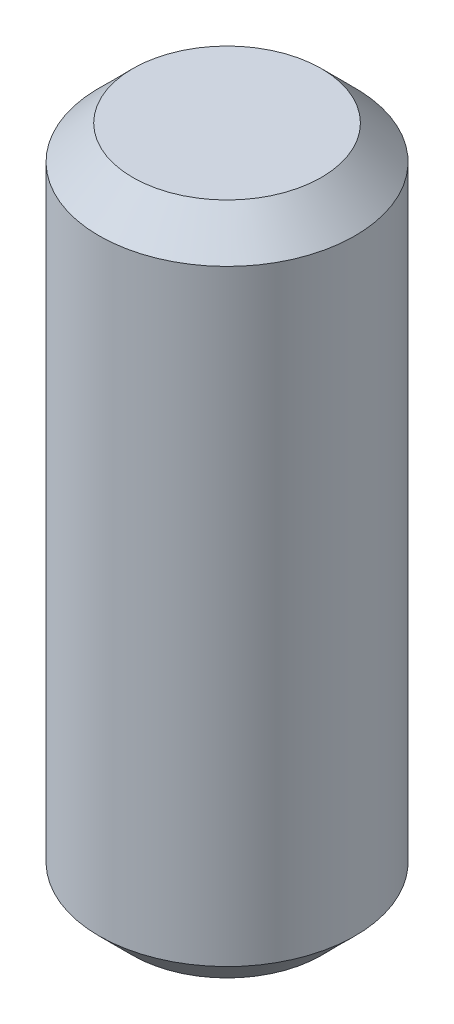
ISO-10303-21;
HEADER;
FILE_DESCRIPTION(('STEP AP214'),'2;1');
FILE_NAME('part.step','',(''),(''),'','','');
FILE_SCHEMA(('AUTOMOTIVE_DESIGN { 1 0 10303 214 1 1 1 1 }'));
ENDSEC;
DATA;
#1=APPLICATION_CONTEXT('core data for automotive mechanical design processes');
#2=APPLICATION_PROTOCOL_DEFINITION('international standard','automotive_design',2000,#1);
#3=PRODUCT_CONTEXT('',#1,'mechanical');
#4=PRODUCT('Part','Part','',(#3));
#5=PRODUCT_RELATED_PRODUCT_CATEGORY('part','',(#4));
#6=PRODUCT_DEFINITION_FORMATION('','',#4);
#7=PRODUCT_DEFINITION_CONTEXT('part definition',#1,'design');
#8=PRODUCT_DEFINITION('design','',#6,#7);
#9=PRODUCT_DEFINITION_SHAPE('','',#8);
#10=(LENGTH_UNIT() NAMED_UNIT(*) SI_UNIT(.MILLI.,.METRE.));
#11=(NAMED_UNIT(*) PLANE_ANGLE_UNIT() SI_UNIT($,.RADIAN.));
#12=(NAMED_UNIT(*) SI_UNIT($,.STERADIAN.) SOLID_ANGLE_UNIT());
#13=UNCERTAINTY_MEASURE_WITH_UNIT(LENGTH_MEASURE(1.E-05),#10,'distance_accuracy_value','');
#14=(GEOMETRIC_REPRESENTATION_CONTEXT(3) GLOBAL_UNCERTAINTY_ASSIGNED_CONTEXT((#13)) GLOBAL_UNIT_ASSIGNED_CONTEXT((#10,
#11,#12)) REPRESENTATION_CONTEXT('',''));
#15=CARTESIAN_POINT('',(0.,0.,0.));
#16=DIRECTION('',(0.,0.,1.));
#17=DIRECTION('',(1.,0.,0.));
#18=AXIS2_PLACEMENT_3D('',#15,#16,#17);
#19=CARTESIAN_POINT('',(0.,10.,0.));
#20=DIRECTION('',(0.,-1.,0.));
#21=DIRECTION('',(0.,0.,-1.));
#22=AXIS2_PLACEMENT_3D('',#19,#20,#21);
#23=CYLINDRICAL_SURFACE('',#22,1.9);
#24=CARTESIAN_POINT('',(0.,9.5,0.));
#25=DIRECTION('',(0.,1.,0.));
#26=DIRECTION('',(0.,0.,1.));
#27=AXIS2_PLACEMENT_3D('',#24,#25,#26);
#28=CIRCLE('',#27,1.9);
#29=CARTESIAN_POINT('',(0.,9.5,1.9));
#30=VERTEX_POINT('',#29);
#31=EDGE_CURVE('E10',#30,#30,#28,.F.);
#32=ORIENTED_EDGE('',*,*,#31,.T.);
#33=EDGE_LOOP('',(#32));
#34=FACE_BOUND('',#33,.T.);
#35=CARTESIAN_POINT('',(0.,0.499999999999997,0.));
#36=DIRECTION('',(0.,1.,0.));
#37=DIRECTION('',(0.,0.,1.));
#38=AXIS2_PLACEMENT_3D('',#35,#36,#37);
#39=CIRCLE('',#38,1.9);
#40=CARTESIAN_POINT('',(0.,0.499999999999997,1.9));
#41=VERTEX_POINT('',#40);
#42=EDGE_CURVE('E55',#41,#41,#39,.T.);
#43=ORIENTED_EDGE('',*,*,#42,.T.);
#44=EDGE_LOOP('',(#43));
#45=FACE_BOUND('',#44,.T.);
#46=ADVANCED_FACE('F39',(#34,#45),#23,.T.);
#47=CARTESIAN_POINT('',(0.,10.,0.));
#48=DIRECTION('',(0.,1.,0.));
#49=DIRECTION('',(0.,0.,1.));
#50=AXIS2_PLACEMENT_3D('',#47,#48,#49);
#51=PLANE('',#50);
#52=CARTESIAN_POINT('',(0.,10.,0.));
#53=DIRECTION('',(0.,1.,0.));
#54=DIRECTION('',(0.,0.,1.));
#55=AXIS2_PLACEMENT_3D('',#52,#53,#54);
#56=CIRCLE('',#55,1.4);
#57=CARTESIAN_POINT('',(0.,10.,1.4));
#58=VERTEX_POINT('',#57);
#59=EDGE_CURVE('E47',#58,#58,#56,.T.);
#60=ORIENTED_EDGE('',*,*,#59,.T.);
#61=EDGE_LOOP('',(#60));
#62=FACE_BOUND('',#61,.T.);
#63=ADVANCED_FACE('F72',(#62),#51,.T.);
#64=CARTESIAN_POINT('',(0.,0.,0.));
#65=DIRECTION('',(0.,1.,0.));
#66=DIRECTION('',(0.,0.,1.));
#67=AXIS2_PLACEMENT_3D('',#64,#65,#66);
#68=PLANE('',#67);
#69=CARTESIAN_POINT('',(0.,0.,0.));
#70=DIRECTION('',(0.,1.,0.));
#71=DIRECTION('',(0.,0.,1.));
#72=AXIS2_PLACEMENT_3D('',#69,#70,#71);
#73=CIRCLE('',#72,1.4);
#74=CARTESIAN_POINT('',(0.,0.,1.4));
#75=VERTEX_POINT('',#74);
#76=EDGE_CURVE('E51',#75,#75,#73,.F.);
#77=ORIENTED_EDGE('',*,*,#76,.T.);
#78=EDGE_LOOP('',(#77));
#79=FACE_BOUND('',#78,.T.);
#80=ADVANCED_FACE('F64',(#79),#68,.F.);
#81=CARTESIAN_POINT('',(0.,0.499999999999997,0.));
#82=DIRECTION('',(0.,1.,0.));
#83=DIRECTION('',(0.,0.,1.));
#84=AXIS2_PLACEMENT_3D('',#81,#82,#83);
#85=CONICAL_SURFACE('',#84,1.9,0.78539816339745);
#86=ORIENTED_EDGE('',*,*,#76,.F.);
#87=EDGE_LOOP('',(#86));
#88=FACE_BOUND('',#87,.T.);
#89=ORIENTED_EDGE('',*,*,#42,.F.);
#90=EDGE_LOOP('',(#89));
#91=FACE_BOUND('',#90,.T.);
#92=ADVANCED_FACE('F62',(#88,#91),#85,.T.);
#93=CARTESIAN_POINT('',(0.,10.,0.));
#94=DIRECTION('',(0.,-1.,0.));
#95=DIRECTION('',(0.,0.,-1.));
#96=AXIS2_PLACEMENT_3D('',#93,#94,#95);
#97=CONICAL_SURFACE('',#96,1.4,0.785398163397446);
#98=ORIENTED_EDGE('',*,*,#31,.F.);
#99=EDGE_LOOP('',(#98));
#100=FACE_BOUND('',#99,.T.);
#101=ORIENTED_EDGE('',*,*,#59,.F.);
#102=EDGE_LOOP('',(#101));
#103=FACE_BOUND('',#102,.T.);
#104=ADVANCED_FACE('F42',(#100,#103),#97,.T.);
#105=CLOSED_SHELL('',(#46,#63,#80,#92,#104));
#106=MANIFOLD_SOLID_BREP('B2',#105);
#107=ADVANCED_BREP_SHAPE_REPRESENTATION('',(#18,#106),#14);
#108=SHAPE_DEFINITION_REPRESENTATION(#9,#107);
ENDSEC;
END-ISO-10303-21;
